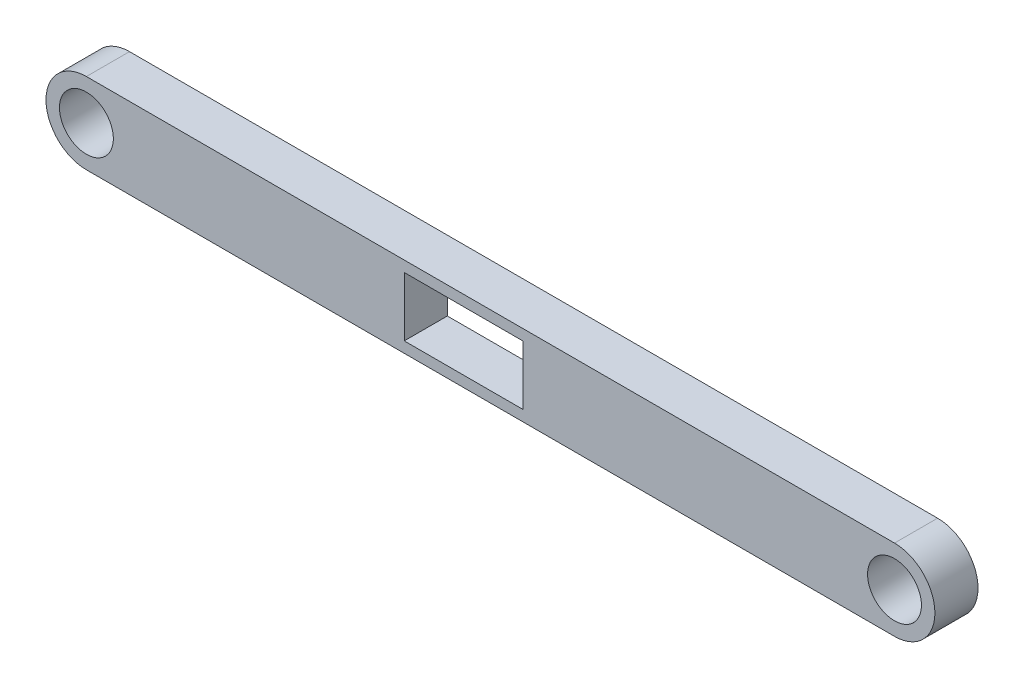
ISO-10303-21;
HEADER;
FILE_DESCRIPTION(('STEP AP214'),'2;1');
FILE_NAME('part.step','',(''),(''),'','','');
FILE_SCHEMA(('AUTOMOTIVE_DESIGN { 1 0 10303 214 1 1 1 1 }'));
ENDSEC;
DATA;
#1=APPLICATION_CONTEXT('core data for automotive mechanical design processes');
#2=APPLICATION_PROTOCOL_DEFINITION('international standard','automotive_design',2000,#1);
#3=PRODUCT_CONTEXT('',#1,'mechanical');
#4=PRODUCT('Part','Part','',(#3));
#5=PRODUCT_RELATED_PRODUCT_CATEGORY('part','',(#4));
#6=PRODUCT_DEFINITION_FORMATION('','',#4);
#7=PRODUCT_DEFINITION_CONTEXT('part definition',#1,'design');
#8=PRODUCT_DEFINITION('design','',#6,#7);
#9=PRODUCT_DEFINITION_SHAPE('','',#8);
#10=(LENGTH_UNIT() NAMED_UNIT(*) SI_UNIT(.MILLI.,.METRE.));
#11=(NAMED_UNIT(*) PLANE_ANGLE_UNIT() SI_UNIT($,.RADIAN.));
#12=(NAMED_UNIT(*) SI_UNIT($,.STERADIAN.) SOLID_ANGLE_UNIT());
#13=UNCERTAINTY_MEASURE_WITH_UNIT(LENGTH_MEASURE(1.E-05),#10,'distance_accuracy_value','');
#14=(GEOMETRIC_REPRESENTATION_CONTEXT(3) GLOBAL_UNCERTAINTY_ASSIGNED_CONTEXT((#13)) GLOBAL_UNIT_ASSIGNED_CONTEXT((#10,
#11,#12)) REPRESENTATION_CONTEXT('',''));
#15=CARTESIAN_POINT('',(0.,0.,0.));
#16=DIRECTION('',(0.,0.,1.));
#17=DIRECTION('',(1.,0.,0.));
#18=AXIS2_PLACEMENT_3D('',#15,#16,#17);
#19=CARTESIAN_POINT('',(75.,0.,8.));
#20=DIRECTION('',(0.,0.,1.));
#21=DIRECTION('',(1.,0.,0.));
#22=AXIS2_PLACEMENT_3D('',#19,#20,#21);
#23=PLANE('',#22);
#24=CARTESIAN_POINT('',(75.,0.,8.));
#25=DIRECTION('',(0.,0.,1.));
#26=DIRECTION('',(1.,0.,0.));
#27=AXIS2_PLACEMENT_3D('',#24,#25,#26);
#28=CIRCLE('',#27,5.);
#29=CARTESIAN_POINT('',(80.,0.,8.));
#30=VERTEX_POINT('',#29);
#31=EDGE_CURVE('E163',#30,#30,#28,.T.);
#32=ORIENTED_EDGE('',*,*,#31,.F.);
#33=EDGE_LOOP('',(#32));
#34=FACE_BOUND('',#33,.T.);
#35=CARTESIAN_POINT('',(75.,0.,8.));
#36=DIRECTION('',(0.,0.,1.));
#37=DIRECTION('',(1.,0.,0.));
#38=AXIS2_PLACEMENT_3D('',#35,#36,#37);
#39=CIRCLE('',#38,7.5);
#40=CARTESIAN_POINT('',(75.,-7.50000000000002,8.));
#41=VERTEX_POINT('',#40);
#42=CARTESIAN_POINT('',(75.,7.49999999999998,8.));
#43=VERTEX_POINT('',#42);
#44=EDGE_CURVE('E171',#41,#43,#39,.T.);
#45=ORIENTED_EDGE('',*,*,#44,.T.);
#46=DIRECTION('',(-1.,0.,0.));
#47=VECTOR('',#46,1.);
#48=CARTESIAN_POINT('',(75.,7.49999999999998,8.));
#49=LINE('',#48,#47);
#50=CARTESIAN_POINT('',(-75.,7.50000000000003,8.));
#51=VERTEX_POINT('',#50);
#52=EDGE_CURVE('E175',#43,#51,#49,.T.);
#53=ORIENTED_EDGE('',*,*,#52,.T.);
#54=CARTESIAN_POINT('',(-75.,0.,8.));
#55=DIRECTION('',(0.,0.,1.));
#56=DIRECTION('',(1.,0.,0.));
#57=AXIS2_PLACEMENT_3D('',#54,#55,#56);
#58=CIRCLE('',#57,7.5);
#59=CARTESIAN_POINT('',(-75.,-7.50000000000004,8.));
#60=VERTEX_POINT('',#59);
#61=EDGE_CURVE('E179',#51,#60,#58,.T.);
#62=ORIENTED_EDGE('',*,*,#61,.T.);
#63=DIRECTION('',(1.,0.,0.));
#64=VECTOR('',#63,1.);
#65=CARTESIAN_POINT('',(75.,-7.50000000000002,8.));
#66=LINE('',#65,#64);
#67=EDGE_CURVE('E182',#60,#41,#66,.T.);
#68=ORIENTED_EDGE('',*,*,#67,.T.);
#69=EDGE_LOOP('',(#45,#53,#62,#68));
#70=FACE_BOUND('',#69,.T.);
#71=CARTESIAN_POINT('',(-75.,0.,8.));
#72=DIRECTION('',(0.,0.,1.));
#73=DIRECTION('',(-1.,0.,0.));
#74=AXIS2_PLACEMENT_3D('',#71,#72,#73);
#75=CIRCLE('',#74,5.);
#76=CARTESIAN_POINT('',(-80.,0.,8.));
#77=VERTEX_POINT('',#76);
#78=EDGE_CURVE('E155',#77,#77,#75,.T.);
#79=ORIENTED_EDGE('',*,*,#78,.F.);
#80=EDGE_LOOP('',(#79));
#81=FACE_BOUND('',#80,.T.);
#82=DIRECTION('',(-1.,0.,0.));
#83=VECTOR('',#82,1.);
#84=CARTESIAN_POINT('',(-16.,5.49999999999996,8.));
#85=LINE('',#84,#83);
#86=CARTESIAN_POINT('',(6.,5.49999999999996,8.));
#87=VERTEX_POINT('',#86);
#88=CARTESIAN_POINT('',(-16.,5.49999999999996,8.));
#89=VERTEX_POINT('',#88);
#90=EDGE_CURVE('E116',#87,#89,#85,.T.);
#91=ORIENTED_EDGE('',*,*,#90,.F.);
#92=DIRECTION('',(0.,1.,0.));
#93=VECTOR('',#92,1.);
#94=CARTESIAN_POINT('',(6.,5.49999999999996,8.));
#95=LINE('',#94,#93);
#96=CARTESIAN_POINT('',(6.,-5.50000000000004,8.));
#97=VERTEX_POINT('',#96);
#98=EDGE_CURVE('E107',#97,#87,#95,.T.);
#99=ORIENTED_EDGE('',*,*,#98,.F.);
#100=DIRECTION('',(1.,0.,0.));
#101=VECTOR('',#100,1.);
#102=CARTESIAN_POINT('',(-16.,-5.50000000000004,8.));
#103=LINE('',#102,#101);
#104=CARTESIAN_POINT('',(-16.,-5.50000000000004,8.));
#105=VERTEX_POINT('',#104);
#106=EDGE_CURVE('E133',#105,#97,#103,.T.);
#107=ORIENTED_EDGE('',*,*,#106,.F.);
#108=DIRECTION('',(0.,-1.,0.));
#109=VECTOR('',#108,1.);
#110=CARTESIAN_POINT('',(-16.,5.49999999999996,8.));
#111=LINE('',#110,#109);
#112=EDGE_CURVE('E129',#89,#105,#111,.T.);
#113=ORIENTED_EDGE('',*,*,#112,.F.);
#114=EDGE_LOOP('',(#91,#99,#107,#113));
#115=FACE_BOUND('',#114,.T.);
#116=ADVANCED_FACE('F41',(#34,#70,#81,#115),#23,.T.);
#117=CARTESIAN_POINT('',(75.,0.,0.));
#118=DIRECTION('',(0.,0.,1.));
#119=DIRECTION('',(1.,0.,0.));
#120=AXIS2_PLACEMENT_3D('',#117,#118,#119);
#121=PLANE('',#120);
#122=CARTESIAN_POINT('',(-75.,0.,0.));
#123=DIRECTION('',(0.,0.,1.));
#124=DIRECTION('',(-1.,0.,0.));
#125=AXIS2_PLACEMENT_3D('',#122,#123,#124);
#126=CIRCLE('',#125,5.);
#127=CARTESIAN_POINT('',(-80.,0.,0.));
#128=VERTEX_POINT('',#127);
#129=EDGE_CURVE('E125',#128,#128,#126,.T.);
#130=ORIENTED_EDGE('',*,*,#129,.T.);
#131=EDGE_LOOP('',(#130));
#132=FACE_BOUND('',#131,.T.);
#133=CARTESIAN_POINT('',(75.,0.,0.));
#134=DIRECTION('',(0.,0.,1.));
#135=DIRECTION('',(1.,0.,0.));
#136=AXIS2_PLACEMENT_3D('',#133,#134,#135);
#137=CIRCLE('',#136,5.);
#138=CARTESIAN_POINT('',(80.,0.,0.));
#139=VERTEX_POINT('',#138);
#140=EDGE_CURVE('E159',#139,#139,#137,.T.);
#141=ORIENTED_EDGE('',*,*,#140,.T.);
#142=EDGE_LOOP('',(#141));
#143=FACE_BOUND('',#142,.T.);
#144=CARTESIAN_POINT('',(75.,0.,0.));
#145=DIRECTION('',(0.,0.,1.));
#146=DIRECTION('',(1.,0.,0.));
#147=AXIS2_PLACEMENT_3D('',#144,#145,#146);
#148=CIRCLE('',#147,7.5);
#149=CARTESIAN_POINT('',(75.,-7.50000000000002,0.));
#150=VERTEX_POINT('',#149);
#151=CARTESIAN_POINT('',(75.,7.49999999999998,0.));
#152=VERTEX_POINT('',#151);
#153=EDGE_CURVE('E167',#150,#152,#148,.T.);
#154=ORIENTED_EDGE('',*,*,#153,.F.);
#155=DIRECTION('',(1.,0.,0.));
#156=VECTOR('',#155,1.);
#157=CARTESIAN_POINT('',(75.,-7.50000000000002,0.));
#158=LINE('',#157,#156);
#159=CARTESIAN_POINT('',(-75.,-7.50000000000004,0.));
#160=VERTEX_POINT('',#159);
#161=EDGE_CURVE('E176',#160,#150,#158,.T.);
#162=ORIENTED_EDGE('',*,*,#161,.F.);
#163=CARTESIAN_POINT('',(-75.,0.,0.));
#164=DIRECTION('',(0.,0.,1.));
#165=DIRECTION('',(1.,0.,0.));
#166=AXIS2_PLACEMENT_3D('',#163,#164,#165);
#167=CIRCLE('',#166,7.5);
#168=CARTESIAN_POINT('',(-75.,7.50000000000003,0.));
#169=VERTEX_POINT('',#168);
#170=EDGE_CURVE('E192',#169,#160,#167,.T.);
#171=ORIENTED_EDGE('',*,*,#170,.F.);
#172=DIRECTION('',(-1.,0.,0.));
#173=VECTOR('',#172,1.);
#174=CARTESIAN_POINT('',(75.,7.49999999999998,0.));
#175=LINE('',#174,#173);
#176=EDGE_CURVE('E189',#152,#169,#175,.T.);
#177=ORIENTED_EDGE('',*,*,#176,.F.);
#178=EDGE_LOOP('',(#154,#162,#171,#177));
#179=FACE_BOUND('',#178,.T.);
#180=DIRECTION('',(0.,1.,0.));
#181=VECTOR('',#180,1.);
#182=CARTESIAN_POINT('',(6.,5.49999999999996,0.));
#183=LINE('',#182,#181);
#184=CARTESIAN_POINT('',(5.99999999999999,-5.50000000000004,0.));
#185=VERTEX_POINT('',#184);
#186=CARTESIAN_POINT('',(6.,5.49999999999996,0.));
#187=VERTEX_POINT('',#186);
#188=EDGE_CURVE('E65',#185,#187,#183,.T.);
#189=ORIENTED_EDGE('',*,*,#188,.T.);
#190=DIRECTION('',(-1.,0.,0.));
#191=VECTOR('',#190,1.);
#192=CARTESIAN_POINT('',(-16.,5.49999999999996,0.));
#193=LINE('',#192,#191);
#194=CARTESIAN_POINT('',(-16.,5.49999999999996,0.));
#195=VERTEX_POINT('',#194);
#196=EDGE_CURVE('E123',#187,#195,#193,.T.);
#197=ORIENTED_EDGE('',*,*,#196,.T.);
#198=DIRECTION('',(0.,-1.,0.));
#199=VECTOR('',#198,1.);
#200=CARTESIAN_POINT('',(-16.,5.49999999999996,0.));
#201=LINE('',#200,#199);
#202=CARTESIAN_POINT('',(-16.,-5.50000000000004,0.));
#203=VERTEX_POINT('',#202);
#204=EDGE_CURVE('E142',#195,#203,#201,.T.);
#205=ORIENTED_EDGE('',*,*,#204,.T.);
#206=DIRECTION('',(1.,0.,0.));
#207=VECTOR('',#206,1.);
#208=CARTESIAN_POINT('',(-16.,-5.50000000000004,0.));
#209=LINE('',#208,#207);
#210=EDGE_CURVE('E117',#203,#185,#209,.T.);
#211=ORIENTED_EDGE('',*,*,#210,.T.);
#212=EDGE_LOOP('',(#189,#197,#205,#211));
#213=FACE_BOUND('',#212,.T.);
#214=ADVANCED_FACE('F215',(#132,#143,#179,#213),#121,.F.);
#215=CARTESIAN_POINT('',(75.,0.,8.));
#216=DIRECTION('',(0.,0.,-1.));
#217=DIRECTION('',(-1.,0.,0.));
#218=AXIS2_PLACEMENT_3D('',#215,#216,#217);
#219=CYLINDRICAL_SURFACE('',#218,7.5);
#220=ORIENTED_EDGE('',*,*,#153,.T.);
#221=DIRECTION('',(0.,0.,-1.));
#222=VECTOR('',#221,1.);
#223=CARTESIAN_POINT('',(75.,7.49999999999998,8.));
#224=LINE('',#223,#222);
#225=EDGE_CURVE('E11',#43,#152,#224,.T.);
#226=ORIENTED_EDGE('',*,*,#225,.F.);
#227=ORIENTED_EDGE('',*,*,#44,.F.);
#228=DIRECTION('',(0.,0.,-1.));
#229=VECTOR('',#228,1.);
#230=CARTESIAN_POINT('',(75.,-7.50000000000002,8.));
#231=LINE('',#230,#229);
#232=EDGE_CURVE('E185',#41,#150,#231,.T.);
#233=ORIENTED_EDGE('',*,*,#232,.T.);
#234=EDGE_LOOP('',(#220,#226,#227,#233));
#235=FACE_BOUND('',#234,.T.);
#236=ADVANCED_FACE('F43',(#235),#219,.T.);
#237=CARTESIAN_POINT('',(75.,7.49999999999998,8.));
#238=DIRECTION('',(0.,-1.,0.));
#239=DIRECTION('',(1.,0.,0.));
#240=AXIS2_PLACEMENT_3D('',#237,#238,#239);
#241=PLANE('',#240);
#242=ORIENTED_EDGE('',*,*,#176,.T.);
#243=DIRECTION('',(0.,0.,-1.));
#244=VECTOR('',#243,1.);
#245=CARTESIAN_POINT('',(-75.,7.50000000000003,8.));
#246=LINE('',#245,#244);
#247=EDGE_CURVE('E50',#51,#169,#246,.T.);
#248=ORIENTED_EDGE('',*,*,#247,.F.);
#249=ORIENTED_EDGE('',*,*,#52,.F.);
#250=ORIENTED_EDGE('',*,*,#225,.T.);
#251=EDGE_LOOP('',(#242,#248,#249,#250));
#252=FACE_BOUND('',#251,.T.);
#253=ADVANCED_FACE('F226',(#252),#241,.F.);
#254=CARTESIAN_POINT('',(-75.,0.,8.));
#255=DIRECTION('',(0.,0.,-1.));
#256=DIRECTION('',(-1.,0.,0.));
#257=AXIS2_PLACEMENT_3D('',#254,#255,#256);
#258=CYLINDRICAL_SURFACE('',#257,7.5);
#259=ORIENTED_EDGE('',*,*,#170,.T.);
#260=DIRECTION('',(0.,0.,-1.));
#261=VECTOR('',#260,1.);
#262=CARTESIAN_POINT('',(-75.,-7.50000000000004,8.));
#263=LINE('',#262,#261);
#264=EDGE_CURVE('E200',#60,#160,#263,.T.);
#265=ORIENTED_EDGE('',*,*,#264,.F.);
#266=ORIENTED_EDGE('',*,*,#61,.F.);
#267=ORIENTED_EDGE('',*,*,#247,.T.);
#268=EDGE_LOOP('',(#259,#265,#266,#267));
#269=FACE_BOUND('',#268,.T.);
#270=ADVANCED_FACE('F209',(#269),#258,.T.);
#271=CARTESIAN_POINT('',(75.,-7.50000000000002,8.));
#272=DIRECTION('',(0.,1.,0.));
#273=DIRECTION('',(-1.,0.,0.));
#274=AXIS2_PLACEMENT_3D('',#271,#272,#273);
#275=PLANE('',#274);
#276=ORIENTED_EDGE('',*,*,#161,.T.);
#277=ORIENTED_EDGE('',*,*,#232,.F.);
#278=ORIENTED_EDGE('',*,*,#67,.F.);
#279=ORIENTED_EDGE('',*,*,#264,.T.);
#280=EDGE_LOOP('',(#276,#277,#278,#279));
#281=FACE_BOUND('',#280,.T.);
#282=ADVANCED_FACE('F219',(#281),#275,.F.);
#283=CARTESIAN_POINT('',(75.,0.,8.));
#284=DIRECTION('',(0.,0.,-1.));
#285=DIRECTION('',(-1.,0.,0.));
#286=AXIS2_PLACEMENT_3D('',#283,#284,#285);
#287=CYLINDRICAL_SURFACE('',#286,5.);
#288=ORIENTED_EDGE('',*,*,#31,.T.);
#289=EDGE_LOOP('',(#288));
#290=FACE_BOUND('',#289,.T.);
#291=ORIENTED_EDGE('',*,*,#140,.F.);
#292=EDGE_LOOP('',(#291));
#293=FACE_BOUND('',#292,.T.);
#294=ADVANCED_FACE('F243',(#290,#293),#287,.F.);
#295=CARTESIAN_POINT('',(-75.,0.,8.));
#296=DIRECTION('',(0.,0.,-1.));
#297=DIRECTION('',(-1.,0.,0.));
#298=AXIS2_PLACEMENT_3D('',#295,#296,#297);
#299=CYLINDRICAL_SURFACE('',#298,5.);
#300=ORIENTED_EDGE('',*,*,#78,.T.);
#301=EDGE_LOOP('',(#300));
#302=FACE_BOUND('',#301,.T.);
#303=ORIENTED_EDGE('',*,*,#129,.F.);
#304=EDGE_LOOP('',(#303));
#305=FACE_BOUND('',#304,.T.);
#306=ADVANCED_FACE('F250',(#302,#305),#299,.F.);
#307=CARTESIAN_POINT('',(6.,5.49999999999996,8.));
#308=DIRECTION('',(-1.,0.,0.));
#309=DIRECTION('',(0.,0.,1.));
#310=AXIS2_PLACEMENT_3D('',#307,#308,#309);
#311=PLANE('',#310);
#312=ORIENTED_EDGE('',*,*,#188,.F.);
#313=DIRECTION('',(0.,0.,-1.));
#314=VECTOR('',#313,1.);
#315=CARTESIAN_POINT('',(6.,-5.50000000000004,8.));
#316=LINE('',#315,#314);
#317=EDGE_CURVE('E111',#97,#185,#316,.T.);
#318=ORIENTED_EDGE('',*,*,#317,.F.);
#319=ORIENTED_EDGE('',*,*,#98,.T.);
#320=DIRECTION('',(0.,0.,-1.));
#321=VECTOR('',#320,1.);
#322=CARTESIAN_POINT('',(6.,5.49999999999996,8.));
#323=LINE('',#322,#321);
#324=EDGE_CURVE('E110',#87,#187,#323,.T.);
#325=ORIENTED_EDGE('',*,*,#324,.T.);
#326=EDGE_LOOP('',(#312,#318,#319,#325));
#327=FACE_BOUND('',#326,.T.);
#328=ADVANCED_FACE('F109',(#327),#311,.T.);
#329=CARTESIAN_POINT('',(-16.,5.49999999999996,8.));
#330=DIRECTION('',(0.,-1.,0.));
#331=DIRECTION('',(0.,0.,-1.));
#332=AXIS2_PLACEMENT_3D('',#329,#330,#331);
#333=PLANE('',#332);
#334=ORIENTED_EDGE('',*,*,#196,.F.);
#335=ORIENTED_EDGE('',*,*,#324,.F.);
#336=ORIENTED_EDGE('',*,*,#90,.T.);
#337=DIRECTION('',(0.,0.,-1.));
#338=VECTOR('',#337,1.);
#339=CARTESIAN_POINT('',(-16.,5.49999999999996,8.));
#340=LINE('',#339,#338);
#341=EDGE_CURVE('E126',#89,#195,#340,.T.);
#342=ORIENTED_EDGE('',*,*,#341,.T.);
#343=EDGE_LOOP('',(#334,#335,#336,#342));
#344=FACE_BOUND('',#343,.T.);
#345=ADVANCED_FACE('F120',(#344),#333,.T.);
#346=CARTESIAN_POINT('',(-16.,5.49999999999996,8.));
#347=DIRECTION('',(1.,0.,0.));
#348=DIRECTION('',(0.,1.,0.));
#349=AXIS2_PLACEMENT_3D('',#346,#347,#348);
#350=PLANE('',#349);
#351=ORIENTED_EDGE('',*,*,#204,.F.);
#352=ORIENTED_EDGE('',*,*,#341,.F.);
#353=ORIENTED_EDGE('',*,*,#112,.T.);
#354=DIRECTION('',(0.,0.,-1.));
#355=VECTOR('',#354,1.);
#356=CARTESIAN_POINT('',(-16.,-5.50000000000004,8.));
#357=LINE('',#356,#355);
#358=EDGE_CURVE('E57',#105,#203,#357,.T.);
#359=ORIENTED_EDGE('',*,*,#358,.T.);
#360=EDGE_LOOP('',(#351,#352,#353,#359));
#361=FACE_BOUND('',#360,.T.);
#362=ADVANCED_FACE('F267',(#361),#350,.T.);
#363=CARTESIAN_POINT('',(-16.,-5.50000000000004,8.));
#364=DIRECTION('',(0.,1.,0.));
#365=DIRECTION('',(0.,0.,1.));
#366=AXIS2_PLACEMENT_3D('',#363,#364,#365);
#367=PLANE('',#366);
#368=ORIENTED_EDGE('',*,*,#210,.F.);
#369=ORIENTED_EDGE('',*,*,#358,.F.);
#370=ORIENTED_EDGE('',*,*,#106,.T.);
#371=ORIENTED_EDGE('',*,*,#317,.T.);
#372=EDGE_LOOP('',(#368,#369,#370,#371));
#373=FACE_BOUND('',#372,.T.);
#374=ADVANCED_FACE('F270',(#373),#367,.T.);
#375=CLOSED_SHELL('',(#116,#214,#236,#253,#270,#282,#294,#306,#328,#345,#362,#374));
#376=MANIFOLD_SOLID_BREP('B2',#375);
#377=ADVANCED_BREP_SHAPE_REPRESENTATION('',(#18,#376),#14);
#378=SHAPE_DEFINITION_REPRESENTATION(#9,#377);
ENDSEC;
END-ISO-10303-21;
